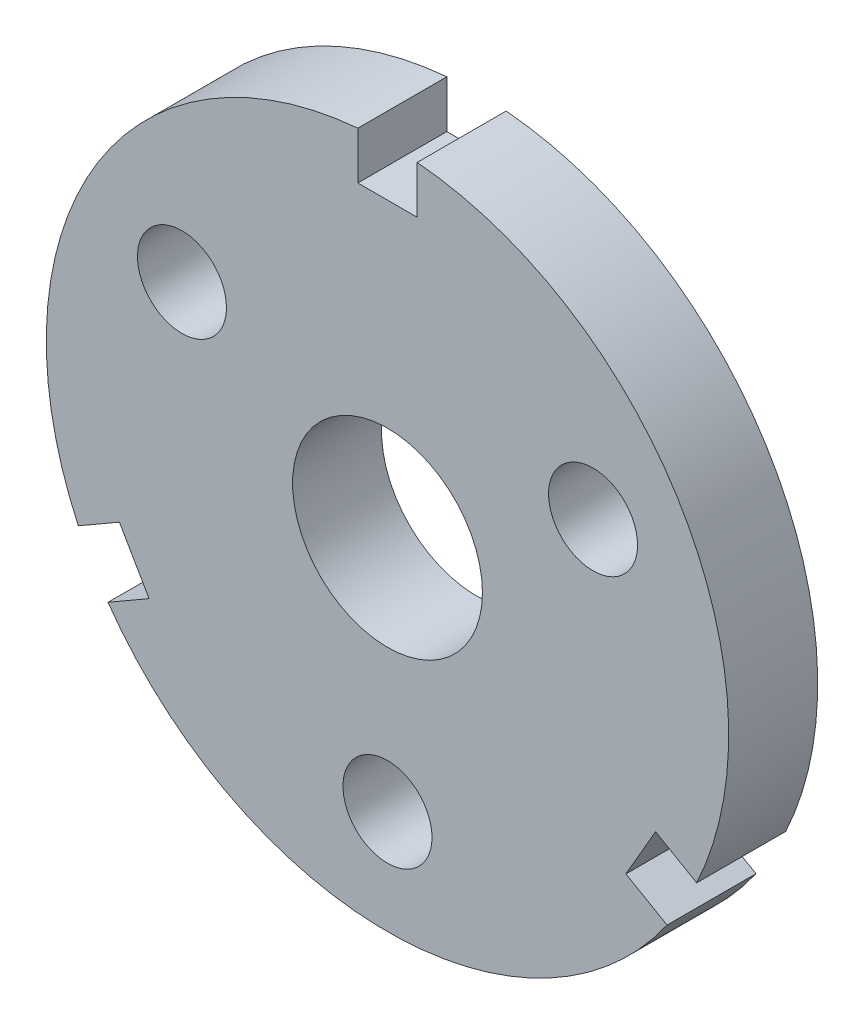
ISO-10303-21;
HEADER;
FILE_DESCRIPTION(('STEP AP214'),'2;1');
FILE_NAME('part.step','',(''),(''),'','','');
FILE_SCHEMA(('AUTOMOTIVE_DESIGN { 1 0 10303 214 1 1 1 1 }'));
ENDSEC;
DATA;
#1=APPLICATION_CONTEXT('core data for automotive mechanical design processes');
#2=APPLICATION_PROTOCOL_DEFINITION('international standard','automotive_design',2000,#1);
#3=PRODUCT_CONTEXT('',#1,'mechanical');
#4=PRODUCT('Part','Part','',(#3));
#5=PRODUCT_RELATED_PRODUCT_CATEGORY('part','',(#4));
#6=PRODUCT_DEFINITION_FORMATION('','',#4);
#7=PRODUCT_DEFINITION_CONTEXT('part definition',#1,'design');
#8=PRODUCT_DEFINITION('design','',#6,#7);
#9=PRODUCT_DEFINITION_SHAPE('','',#8);
#10=(LENGTH_UNIT() NAMED_UNIT(*) SI_UNIT(.MILLI.,.METRE.));
#11=(NAMED_UNIT(*) PLANE_ANGLE_UNIT() SI_UNIT($,.RADIAN.));
#12=(NAMED_UNIT(*) SI_UNIT($,.STERADIAN.) SOLID_ANGLE_UNIT());
#13=UNCERTAINTY_MEASURE_WITH_UNIT(LENGTH_MEASURE(1.E-05),#10,'distance_accuracy_value','');
#14=(GEOMETRIC_REPRESENTATION_CONTEXT(3) GLOBAL_UNCERTAINTY_ASSIGNED_CONTEXT((#13)) GLOBAL_UNIT_ASSIGNED_CONTEXT((#10,
#11,#12)) REPRESENTATION_CONTEXT('',''));
#15=CARTESIAN_POINT('',(0.,0.,0.));
#16=DIRECTION('',(0.,0.,1.));
#17=DIRECTION('',(1.,0.,0.));
#18=AXIS2_PLACEMENT_3D('',#15,#16,#17);
#19=CARTESIAN_POINT('',(-5.,0.,15.));
#20=DIRECTION('',(1.,0.,0.));
#21=DIRECTION('',(0.,0.,-1.));
#22=AXIS2_PLACEMENT_3D('',#19,#20,#21);
#23=PLANE('',#22);
#24=DIRECTION('',(0.,-1.,0.));
#25=VECTOR('',#24,1.);
#26=CARTESIAN_POINT('',(-5.,0.,0.));
#27=LINE('',#26,#25);
#28=CARTESIAN_POINT('',(-5.,57.282196186948,0.));
#29=VERTEX_POINT('',#28);
#30=CARTESIAN_POINT('',(-5.,49.282196186948,0.));
#31=VERTEX_POINT('',#30);
#32=EDGE_CURVE('E176',#29,#31,#27,.T.);
#33=ORIENTED_EDGE('',*,*,#32,.F.);
#34=DIRECTION('',(0.,0.,-1.));
#35=VECTOR('',#34,1.);
#36=CARTESIAN_POINT('',(-5.,57.282196186948,15.));
#37=LINE('',#36,#35);
#38=CARTESIAN_POINT('',(-5.,57.282196186948,15.));
#39=VERTEX_POINT('',#38);
#40=EDGE_CURVE('E11',#39,#29,#37,.T.);
#41=ORIENTED_EDGE('',*,*,#40,.F.);
#42=DIRECTION('',(0.,-1.,0.));
#43=VECTOR('',#42,1.);
#44=CARTESIAN_POINT('',(-5.,0.,15.));
#45=LINE('',#44,#43);
#46=CARTESIAN_POINT('',(-5.,49.282196186948,15.));
#47=VERTEX_POINT('',#46);
#48=EDGE_CURVE('E214',#39,#47,#45,.T.);
#49=ORIENTED_EDGE('',*,*,#48,.T.);
#50=DIRECTION('',(0.,0.,-1.));
#51=VECTOR('',#50,1.);
#52=CARTESIAN_POINT('',(-5.,49.282196186948,15.));
#53=LINE('',#52,#51);
#54=EDGE_CURVE('E107',#47,#31,#53,.T.);
#55=ORIENTED_EDGE('',*,*,#54,.T.);
#56=EDGE_LOOP('',(#33,#41,#49,#55));
#57=FACE_BOUND('',#56,.T.);
#58=ADVANCED_FACE('F43',(#57),#23,.T.);
#59=CARTESIAN_POINT('',(0.,0.,15.));
#60=DIRECTION('',(0.,0.,-1.));
#61=DIRECTION('',(-1.,0.,0.));
#62=AXIS2_PLACEMENT_3D('',#59,#60,#61);
#63=CYLINDRICAL_SURFACE('',#62,57.5);
#64=CARTESIAN_POINT('',(0.,0.,0.));
#65=DIRECTION('',(0.,0.,1.));
#66=DIRECTION('',(1.,0.,0.));
#67=AXIS2_PLACEMENT_3D('',#64,#65,#66);
#68=CIRCLE('',#67,57.5);
#69=CARTESIAN_POINT('',(-52.1078370824611,-24.3109710745517,0.));
#70=VERTEX_POINT('',#69);
#71=EDGE_CURVE('E177',#29,#70,#68,.T.);
#72=ORIENTED_EDGE('',*,*,#71,.T.);
#73=DIRECTION('',(0.,0.,-1.));
#74=VECTOR('',#73,1.);
#75=CARTESIAN_POINT('',(-52.1078370824611,-24.3109710745517,15.));
#76=LINE('',#75,#74);
#77=CARTESIAN_POINT('',(-52.1078370824611,-24.3109710745517,15.));
#78=VERTEX_POINT('',#77);
#79=EDGE_CURVE('E51',#78,#70,#76,.T.);
#80=ORIENTED_EDGE('',*,*,#79,.F.);
#81=CARTESIAN_POINT('',(0.,0.,15.));
#82=DIRECTION('',(0.,0.,1.));
#83=DIRECTION('',(1.,0.,0.));
#84=AXIS2_PLACEMENT_3D('',#81,#82,#83);
#85=CIRCLE('',#84,57.5);
#86=EDGE_CURVE('E148',#39,#78,#85,.T.);
#87=ORIENTED_EDGE('',*,*,#86,.F.);
#88=ORIENTED_EDGE('',*,*,#40,.T.);
#89=EDGE_LOOP('',(#72,#80,#87,#88));
#90=FACE_BOUND('',#89,.T.);
#91=ADVANCED_FACE('F279',(#90),#63,.T.);
#92=CARTESIAN_POINT('',(-2.49999999999999,4.33012701892219,15.));
#93=DIRECTION('',(-0.499999999999998,0.86602540378444,0.));
#94=DIRECTION('',(-0.86602540378444,-0.499999999999998,0.));
#95=AXIS2_PLACEMENT_3D('',#92,#93,#94);
#96=PLANE('',#95);
#97=DIRECTION('',(0.86602540378444,0.499999999999998,0.));
#98=VECTOR('',#97,1.);
#99=CARTESIAN_POINT('',(-2.49999999999999,4.33012701892219,0.));
#100=LINE('',#99,#98);
#101=CARTESIAN_POINT('',(-45.1796338521856,-20.3109710745517,0.));
#102=VERTEX_POINT('',#101);
#103=EDGE_CURVE('E181',#70,#102,#100,.T.);
#104=ORIENTED_EDGE('',*,*,#103,.T.);
#105=DIRECTION('',(0.,0.,-1.));
#106=VECTOR('',#105,1.);
#107=CARTESIAN_POINT('',(-45.1796338521856,-20.3109710745517,15.));
#108=LINE('',#107,#106);
#109=CARTESIAN_POINT('',(-45.1796338521856,-20.3109710745517,15.));
#110=VERTEX_POINT('',#109);
#111=EDGE_CURVE('E229',#110,#102,#108,.T.);
#112=ORIENTED_EDGE('',*,*,#111,.F.);
#113=DIRECTION('',(0.86602540378444,0.499999999999998,0.));
#114=VECTOR('',#113,1.);
#115=CARTESIAN_POINT('',(-2.49999999999999,4.33012701892219,15.));
#116=LINE('',#115,#114);
#117=EDGE_CURVE('E239',#78,#110,#116,.T.);
#118=ORIENTED_EDGE('',*,*,#117,.F.);
#119=ORIENTED_EDGE('',*,*,#79,.T.);
#120=EDGE_LOOP('',(#104,#112,#118,#119));
#121=FACE_BOUND('',#120,.T.);
#122=ADVANCED_FACE('F237',(#121),#96,.F.);
#123=CARTESIAN_POINT('',(-42.6796338521857,-24.6410980934739,15.));
#124=DIRECTION('',(-0.86602540378444,-0.499999999999997,0.));
#125=DIRECTION('',(0.499999999999997,-0.86602540378444,0.));
#126=AXIS2_PLACEMENT_3D('',#123,#124,#125);
#127=PLANE('',#126);
#128=DIRECTION('',(-0.499999999999997,0.86602540378444,0.));
#129=VECTOR('',#128,1.);
#130=CARTESIAN_POINT('',(-42.6796338521857,-24.6410980934739,0.));
#131=LINE('',#130,#129);
#132=CARTESIAN_POINT('',(-40.1796338521856,-28.9712251123961,0.));
#133=VERTEX_POINT('',#132);
#134=EDGE_CURVE('E184',#133,#102,#131,.T.);
#135=ORIENTED_EDGE('',*,*,#134,.F.);
#136=DIRECTION('',(0.,0.,-1.));
#137=VECTOR('',#136,1.);
#138=CARTESIAN_POINT('',(-40.1796338521856,-28.9712251123961,15.));
#139=LINE('',#138,#137);
#140=CARTESIAN_POINT('',(-40.1796338521856,-28.9712251123961,15.));
#141=VERTEX_POINT('',#140);
#142=EDGE_CURVE('E228',#141,#133,#139,.T.);
#143=ORIENTED_EDGE('',*,*,#142,.F.);
#144=DIRECTION('',(-0.499999999999997,0.86602540378444,0.));
#145=VECTOR('',#144,1.);
#146=CARTESIAN_POINT('',(-42.6796338521857,-24.6410980934739,15.));
#147=LINE('',#146,#145);
#148=EDGE_CURVE('E252',#141,#110,#147,.T.);
#149=ORIENTED_EDGE('',*,*,#148,.T.);
#150=ORIENTED_EDGE('',*,*,#111,.T.);
#151=EDGE_LOOP('',(#135,#143,#149,#150));
#152=FACE_BOUND('',#151,.T.);
#153=ADVANCED_FACE('F246',(#152),#127,.T.);
#154=CARTESIAN_POINT('',(2.49999999999999,-4.3301270189222,15.));
#155=DIRECTION('',(-0.499999999999998,0.86602540378444,0.));
#156=DIRECTION('',(-0.86602540378444,-0.499999999999998,0.));
#157=AXIS2_PLACEMENT_3D('',#154,#155,#156);
#158=PLANE('',#157);
#159=DIRECTION('',(0.86602540378444,0.499999999999998,0.));
#160=VECTOR('',#159,1.);
#161=CARTESIAN_POINT('',(2.49999999999999,-4.3301270189222,0.));
#162=LINE('',#161,#160);
#163=CARTESIAN_POINT('',(-47.1078370824611,-32.9712251123961,0.));
#164=VERTEX_POINT('',#163);
#165=EDGE_CURVE('E187',#164,#133,#162,.T.);
#166=ORIENTED_EDGE('',*,*,#165,.F.);
#167=DIRECTION('',(0.,0.,-1.));
#168=VECTOR('',#167,1.);
#169=CARTESIAN_POINT('',(-47.1078370824611,-32.9712251123961,15.));
#170=LINE('',#169,#168);
#171=CARTESIAN_POINT('',(-47.1078370824611,-32.9712251123961,15.));
#172=VERTEX_POINT('',#171);
#173=EDGE_CURVE('E226',#172,#164,#170,.T.);
#174=ORIENTED_EDGE('',*,*,#173,.F.);
#175=DIRECTION('',(0.86602540378444,0.499999999999998,0.));
#176=VECTOR('',#175,1.);
#177=CARTESIAN_POINT('',(2.49999999999999,-4.3301270189222,15.));
#178=LINE('',#177,#176);
#179=EDGE_CURVE('E251',#172,#141,#178,.T.);
#180=ORIENTED_EDGE('',*,*,#179,.T.);
#181=ORIENTED_EDGE('',*,*,#142,.T.);
#182=EDGE_LOOP('',(#166,#174,#180,#181));
#183=FACE_BOUND('',#182,.T.);
#184=ADVANCED_FACE('F292',(#183),#158,.T.);
#185=CARTESIAN_POINT('',(47.1078370824614,-32.9712251123957,0.));
#186=VERTEX_POINT('',#185);
#187=EDGE_CURVE('E185',#164,#186,#68,.T.);
#188=ORIENTED_EDGE('',*,*,#187,.T.);
#189=DIRECTION('',(0.,0.,-1.));
#190=VECTOR('',#189,1.);
#191=CARTESIAN_POINT('',(47.1078370824614,-32.9712251123957,15.));
#192=LINE('',#191,#190);
#193=CARTESIAN_POINT('',(47.1078370824614,-32.9712251123957,15.));
#194=VERTEX_POINT('',#193);
#195=EDGE_CURVE('E223',#194,#186,#192,.T.);
#196=ORIENTED_EDGE('',*,*,#195,.F.);
#197=EDGE_CURVE('E146',#172,#194,#85,.T.);
#198=ORIENTED_EDGE('',*,*,#197,.F.);
#199=ORIENTED_EDGE('',*,*,#173,.T.);
#200=EDGE_LOOP('',(#188,#196,#198,#199));
#201=FACE_BOUND('',#200,.T.);
#202=ADVANCED_FACE('F269',(#201),#63,.T.);
#203=CARTESIAN_POINT('',(-2.49999999999992,-4.33012701892214,15.));
#204=DIRECTION('',(-0.499999999999993,-0.866025403784443,0.));
#205=DIRECTION('',(0.866025403784443,-0.499999999999993,0.));
#206=AXIS2_PLACEMENT_3D('',#203,#204,#205);
#207=PLANE('',#206);
#208=DIRECTION('',(-0.866025403784443,0.499999999999993,0.));
#209=VECTOR('',#208,1.);
#210=CARTESIAN_POINT('',(-2.49999999999992,-4.33012701892214,0.));
#211=LINE('',#210,#209);
#212=CARTESIAN_POINT('',(40.1796338521859,-28.9712251123958,0.));
#213=VERTEX_POINT('',#212);
#214=EDGE_CURVE('E192',#186,#213,#211,.T.);
#215=ORIENTED_EDGE('',*,*,#214,.T.);
#216=DIRECTION('',(0.,0.,-1.));
#217=VECTOR('',#216,1.);
#218=CARTESIAN_POINT('',(40.1796338521859,-28.9712251123958,15.));
#219=LINE('',#218,#217);
#220=CARTESIAN_POINT('',(40.1796338521859,-28.9712251123958,15.));
#221=VERTEX_POINT('',#220);
#222=EDGE_CURVE('E221',#221,#213,#219,.T.);
#223=ORIENTED_EDGE('',*,*,#222,.F.);
#224=DIRECTION('',(-0.866025403784443,0.499999999999993,0.));
#225=VECTOR('',#224,1.);
#226=CARTESIAN_POINT('',(-2.49999999999992,-4.33012701892214,15.));
#227=LINE('',#226,#225);
#228=EDGE_CURVE('E260',#194,#221,#227,.T.);
#229=ORIENTED_EDGE('',*,*,#228,.F.);
#230=ORIENTED_EDGE('',*,*,#195,.T.);
#231=EDGE_LOOP('',(#215,#223,#229,#230));
#232=FACE_BOUND('',#231,.T.);
#233=ADVANCED_FACE('F274',(#232),#207,.F.);
#234=CARTESIAN_POINT('',(42.6796338521858,-24.6410980934735,15.));
#235=DIRECTION('',(0.866025403784444,-0.499999999999991,0.));
#236=DIRECTION('',(0.499999999999991,0.866025403784444,0.));
#237=AXIS2_PLACEMENT_3D('',#234,#235,#236);
#238=PLANE('',#237);
#239=DIRECTION('',(-0.499999999999991,-0.866025403784444,0.));
#240=VECTOR('',#239,1.);
#241=CARTESIAN_POINT('',(42.6796338521858,-24.6410980934735,0.));
#242=LINE('',#241,#240);
#243=CARTESIAN_POINT('',(45.1796338521858,-20.3109710745514,0.));
#244=VERTEX_POINT('',#243);
#245=EDGE_CURVE('E191',#244,#213,#242,.T.);
#246=ORIENTED_EDGE('',*,*,#245,.F.);
#247=DIRECTION('',(0.,0.,-1.));
#248=VECTOR('',#247,1.);
#249=CARTESIAN_POINT('',(45.1796338521858,-20.3109710745514,15.));
#250=LINE('',#249,#248);
#251=CARTESIAN_POINT('',(45.1796338521858,-20.3109710745514,15.));
#252=VERTEX_POINT('',#251);
#253=EDGE_CURVE('E219',#252,#244,#250,.T.);
#254=ORIENTED_EDGE('',*,*,#253,.F.);
#255=DIRECTION('',(-0.499999999999991,-0.866025403784444,0.));
#256=VECTOR('',#255,1.);
#257=CARTESIAN_POINT('',(42.6796338521858,-24.6410980934735,15.));
#258=LINE('',#257,#256);
#259=EDGE_CURVE('E259',#252,#221,#258,.T.);
#260=ORIENTED_EDGE('',*,*,#259,.T.);
#261=ORIENTED_EDGE('',*,*,#222,.T.);
#262=EDGE_LOOP('',(#246,#254,#260,#261));
#263=FACE_BOUND('',#262,.T.);
#264=ADVANCED_FACE('F280',(#263),#238,.T.);
#265=CARTESIAN_POINT('',(2.49999999999994,4.3301270189222,15.));
#266=DIRECTION('',(-0.499999999999991,-0.866025403784444,0.));
#267=DIRECTION('',(0.866025403784444,-0.499999999999991,0.));
#268=AXIS2_PLACEMENT_3D('',#265,#266,#267);
#269=PLANE('',#268);
#270=DIRECTION('',(-0.866025403784444,0.499999999999991,0.));
#271=VECTOR('',#270,1.);
#272=CARTESIAN_POINT('',(2.49999999999994,4.3301270189222,0.));
#273=LINE('',#272,#271);
#274=CARTESIAN_POINT('',(52.1078370824613,-24.3109710745513,0.));
#275=VERTEX_POINT('',#274);
#276=EDGE_CURVE('E199',#275,#244,#273,.T.);
#277=ORIENTED_EDGE('',*,*,#276,.F.);
#278=DIRECTION('',(0.,0.,-1.));
#279=VECTOR('',#278,1.);
#280=CARTESIAN_POINT('',(52.1078370824613,-24.3109710745513,15.));
#281=LINE('',#280,#279);
#282=CARTESIAN_POINT('',(52.1078370824613,-24.3109710745513,15.));
#283=VERTEX_POINT('',#282);
#284=EDGE_CURVE('E153',#283,#275,#281,.T.);
#285=ORIENTED_EDGE('',*,*,#284,.F.);
#286=DIRECTION('',(-0.866025403784444,0.499999999999991,0.));
#287=VECTOR('',#286,1.);
#288=CARTESIAN_POINT('',(2.49999999999994,4.3301270189222,15.));
#289=LINE('',#288,#287);
#290=EDGE_CURVE('E147',#283,#252,#289,.T.);
#291=ORIENTED_EDGE('',*,*,#290,.T.);
#292=ORIENTED_EDGE('',*,*,#253,.T.);
#293=EDGE_LOOP('',(#277,#285,#291,#292));
#294=FACE_BOUND('',#293,.T.);
#295=ADVANCED_FACE('F262',(#294),#269,.T.);
#296=CARTESIAN_POINT('',(5.,57.282196186948,0.));
#297=VERTEX_POINT('',#296);
#298=EDGE_CURVE('E151',#275,#297,#68,.T.);
#299=ORIENTED_EDGE('',*,*,#298,.T.);
#300=DIRECTION('',(0.,0.,-1.));
#301=VECTOR('',#300,1.);
#302=CARTESIAN_POINT('',(5.,57.282196186948,15.));
#303=LINE('',#302,#301);
#304=CARTESIAN_POINT('',(5.,57.282196186948,15.));
#305=VERTEX_POINT('',#304);
#306=EDGE_CURVE('E152',#305,#297,#303,.T.);
#307=ORIENTED_EDGE('',*,*,#306,.F.);
#308=EDGE_CURVE('E138',#283,#305,#85,.T.);
#309=ORIENTED_EDGE('',*,*,#308,.F.);
#310=ORIENTED_EDGE('',*,*,#284,.T.);
#311=EDGE_LOOP('',(#299,#307,#309,#310));
#312=FACE_BOUND('',#311,.T.);
#313=ADVANCED_FACE('F154',(#312),#63,.T.);
#314=CARTESIAN_POINT('',(5.,0.,15.));
#315=DIRECTION('',(1.,0.,0.));
#316=DIRECTION('',(0.,0.,-1.));
#317=AXIS2_PLACEMENT_3D('',#314,#315,#316);
#318=PLANE('',#317);
#319=DIRECTION('',(0.,-1.,0.));
#320=VECTOR('',#319,1.);
#321=CARTESIAN_POINT('',(5.,0.,0.));
#322=LINE('',#321,#320);
#323=CARTESIAN_POINT('',(5.,49.282196186948,0.));
#324=VERTEX_POINT('',#323);
#325=EDGE_CURVE('E98',#297,#324,#322,.T.);
#326=ORIENTED_EDGE('',*,*,#325,.T.);
#327=DIRECTION('',(0.,0.,-1.));
#328=VECTOR('',#327,1.);
#329=CARTESIAN_POINT('',(5.,49.282196186948,15.));
#330=LINE('',#329,#328);
#331=CARTESIAN_POINT('',(5.,49.282196186948,15.));
#332=VERTEX_POINT('',#331);
#333=EDGE_CURVE('E157',#332,#324,#330,.T.);
#334=ORIENTED_EDGE('',*,*,#333,.F.);
#335=DIRECTION('',(0.,-1.,0.));
#336=VECTOR('',#335,1.);
#337=CARTESIAN_POINT('',(5.,0.,15.));
#338=LINE('',#337,#336);
#339=EDGE_CURVE('E142',#305,#332,#338,.T.);
#340=ORIENTED_EDGE('',*,*,#339,.F.);
#341=ORIENTED_EDGE('',*,*,#306,.T.);
#342=EDGE_LOOP('',(#326,#334,#340,#341));
#343=FACE_BOUND('',#342,.T.);
#344=ADVANCED_FACE('F156',(#343),#318,.F.);
#345=CARTESIAN_POINT('',(0.,-40.,15.));
#346=DIRECTION('',(0.,0.,-1.));
#347=DIRECTION('',(-1.,0.,0.));
#348=AXIS2_PLACEMENT_3D('',#345,#346,#347);
#349=CYLINDRICAL_SURFACE('',#348,7.5);
#350=CARTESIAN_POINT('',(0.,-40.,15.));
#351=DIRECTION('',(0.,0.,1.));
#352=DIRECTION('',(1.,0.,0.));
#353=AXIS2_PLACEMENT_3D('',#350,#351,#352);
#354=CIRCLE('',#353,7.5);
#355=CARTESIAN_POINT('',(7.5,-40.,15.));
#356=VERTEX_POINT('',#355);
#357=EDGE_CURVE('E169',#356,#356,#354,.T.);
#358=ORIENTED_EDGE('',*,*,#357,.T.);
#359=EDGE_LOOP('',(#358));
#360=FACE_BOUND('',#359,.T.);
#361=CARTESIAN_POINT('',(0.,-40.,0.));
#362=DIRECTION('',(0.,0.,1.));
#363=DIRECTION('',(1.,0.,0.));
#364=AXIS2_PLACEMENT_3D('',#361,#362,#363);
#365=CIRCLE('',#364,7.5);
#366=CARTESIAN_POINT('',(7.5,-40.,0.));
#367=VERTEX_POINT('',#366);
#368=EDGE_CURVE('E206',#367,#367,#365,.T.);
#369=ORIENTED_EDGE('',*,*,#368,.F.);
#370=EDGE_LOOP('',(#369));
#371=FACE_BOUND('',#370,.T.);
#372=ADVANCED_FACE('F299',(#360,#371),#349,.F.);
#373=CARTESIAN_POINT('',(-34.6410161513775,20.,15.));
#374=DIRECTION('',(0.,0.,-1.));
#375=DIRECTION('',(-1.,0.,0.));
#376=AXIS2_PLACEMENT_3D('',#373,#374,#375);
#377=CYLINDRICAL_SURFACE('',#376,7.49999999999999);
#378=CARTESIAN_POINT('',(-34.6410161513775,20.,15.));
#379=DIRECTION('',(0.,0.,1.));
#380=DIRECTION('',(1.,0.,0.));
#381=AXIS2_PLACEMENT_3D('',#378,#379,#380);
#382=CIRCLE('',#381,7.49999999999999);
#383=CARTESIAN_POINT('',(-27.1410161513775,20.,15.));
#384=VERTEX_POINT('',#383);
#385=EDGE_CURVE('E167',#384,#384,#382,.T.);
#386=ORIENTED_EDGE('',*,*,#385,.T.);
#387=EDGE_LOOP('',(#386));
#388=FACE_BOUND('',#387,.T.);
#389=CARTESIAN_POINT('',(-34.6410161513775,20.,0.));
#390=DIRECTION('',(0.,0.,1.));
#391=DIRECTION('',(1.,0.,0.));
#392=AXIS2_PLACEMENT_3D('',#389,#390,#391);
#393=CIRCLE('',#392,7.49999999999999);
#394=CARTESIAN_POINT('',(-27.1410161513775,20.,0.));
#395=VERTEX_POINT('',#394);
#396=EDGE_CURVE('E207',#395,#395,#393,.T.);
#397=ORIENTED_EDGE('',*,*,#396,.F.);
#398=EDGE_LOOP('',(#397));
#399=FACE_BOUND('',#398,.T.);
#400=ADVANCED_FACE('F360',(#388,#399),#377,.F.);
#401=CARTESIAN_POINT('',(0.,0.,15.));
#402=DIRECTION('',(0.,0.,-1.));
#403=DIRECTION('',(-1.,0.,0.));
#404=AXIS2_PLACEMENT_3D('',#401,#402,#403);
#405=CYLINDRICAL_SURFACE('',#404,16.);
#406=CARTESIAN_POINT('',(0.,0.,15.));
#407=DIRECTION('',(0.,0.,1.));
#408=DIRECTION('',(1.,0.,0.));
#409=AXIS2_PLACEMENT_3D('',#406,#407,#408);
#410=CIRCLE('',#409,16.);
#411=CARTESIAN_POINT('',(16.,0.,15.));
#412=VERTEX_POINT('',#411);
#413=EDGE_CURVE('E158',#412,#412,#410,.T.);
#414=ORIENTED_EDGE('',*,*,#413,.T.);
#415=EDGE_LOOP('',(#414));
#416=FACE_BOUND('',#415,.T.);
#417=CARTESIAN_POINT('',(0.,0.,0.));
#418=DIRECTION('',(0.,0.,1.));
#419=DIRECTION('',(1.,0.,0.));
#420=AXIS2_PLACEMENT_3D('',#417,#418,#419);
#421=CIRCLE('',#420,16.);
#422=CARTESIAN_POINT('',(16.,0.,0.));
#423=VERTEX_POINT('',#422);
#424=EDGE_CURVE('E201',#423,#423,#421,.T.);
#425=ORIENTED_EDGE('',*,*,#424,.F.);
#426=EDGE_LOOP('',(#425));
#427=FACE_BOUND('',#426,.T.);
#428=ADVANCED_FACE('F370',(#416,#427),#405,.F.);
#429=CARTESIAN_POINT('',(0.,49.282196186948,15.));
#430=DIRECTION('',(0.,-1.,0.));
#431=DIRECTION('',(0.,0.,-1.));
#432=AXIS2_PLACEMENT_3D('',#429,#430,#431);
#433=PLANE('',#432);
#434=DIRECTION('',(-1.,0.,0.));
#435=VECTOR('',#434,1.);
#436=CARTESIAN_POINT('',(0.,49.282196186948,0.));
#437=LINE('',#436,#435);
#438=EDGE_CURVE('E202',#324,#31,#437,.T.);
#439=ORIENTED_EDGE('',*,*,#438,.T.);
#440=ORIENTED_EDGE('',*,*,#54,.F.);
#441=DIRECTION('',(-1.,0.,0.));
#442=VECTOR('',#441,1.);
#443=CARTESIAN_POINT('',(0.,49.282196186948,15.));
#444=LINE('',#443,#442);
#445=EDGE_CURVE('E56',#332,#47,#444,.T.);
#446=ORIENTED_EDGE('',*,*,#445,.F.);
#447=ORIENTED_EDGE('',*,*,#333,.T.);
#448=EDGE_LOOP('',(#439,#440,#446,#447));
#449=FACE_BOUND('',#448,.T.);
#450=ADVANCED_FACE('F379',(#449),#433,.F.);
#451=CARTESIAN_POINT('',(34.6410161513775,20.,15.));
#452=DIRECTION('',(0.,0.,-1.));
#453=DIRECTION('',(-1.,0.,0.));
#454=AXIS2_PLACEMENT_3D('',#451,#452,#453);
#455=CYLINDRICAL_SURFACE('',#454,7.49999999999999);
#456=CARTESIAN_POINT('',(34.6410161513775,20.,15.));
#457=DIRECTION('',(0.,0.,1.));
#458=DIRECTION('',(1.,0.,0.));
#459=AXIS2_PLACEMENT_3D('',#456,#457,#458);
#460=CIRCLE('',#459,7.49999999999999);
#461=CARTESIAN_POINT('',(42.1410161513775,20.,15.));
#462=VERTEX_POINT('',#461);
#463=EDGE_CURVE('E171',#462,#462,#460,.F.);
#464=ORIENTED_EDGE('',*,*,#463,.F.);
#465=EDGE_LOOP('',(#464));
#466=FACE_BOUND('',#465,.T.);
#467=CARTESIAN_POINT('',(34.6410161513775,20.,0.));
#468=DIRECTION('',(0.,0.,1.));
#469=DIRECTION('',(1.,0.,0.));
#470=AXIS2_PLACEMENT_3D('',#467,#468,#469);
#471=CIRCLE('',#470,7.49999999999999);
#472=CARTESIAN_POINT('',(42.1410161513775,20.,0.));
#473=VERTEX_POINT('',#472);
#474=EDGE_CURVE('E212',#473,#473,#471,.F.);
#475=ORIENTED_EDGE('',*,*,#474,.T.);
#476=EDGE_LOOP('',(#475));
#477=FACE_BOUND('',#476,.T.);
#478=ADVANCED_FACE('F389',(#466,#477),#455,.F.);
#479=CARTESIAN_POINT('',(0.,0.,15.));
#480=DIRECTION('',(0.,0.,1.));
#481=DIRECTION('',(1.,0.,0.));
#482=AXIS2_PLACEMENT_3D('',#479,#480,#481);
#483=PLANE('',#482);
#484=ORIENTED_EDGE('',*,*,#48,.F.);
#485=ORIENTED_EDGE('',*,*,#86,.T.);
#486=ORIENTED_EDGE('',*,*,#117,.T.);
#487=ORIENTED_EDGE('',*,*,#148,.F.);
#488=ORIENTED_EDGE('',*,*,#179,.F.);
#489=ORIENTED_EDGE('',*,*,#197,.T.);
#490=ORIENTED_EDGE('',*,*,#228,.T.);
#491=ORIENTED_EDGE('',*,*,#259,.F.);
#492=ORIENTED_EDGE('',*,*,#290,.F.);
#493=ORIENTED_EDGE('',*,*,#308,.T.);
#494=ORIENTED_EDGE('',*,*,#339,.T.);
#495=ORIENTED_EDGE('',*,*,#445,.T.);
#496=EDGE_LOOP('',(#484,#485,#486,#487,#488,#489,#490,#491,#492,#493,#494,#495));
#497=FACE_BOUND('',#496,.T.);
#498=ORIENTED_EDGE('',*,*,#413,.F.);
#499=EDGE_LOOP('',(#498));
#500=FACE_BOUND('',#499,.T.);
#501=ORIENTED_EDGE('',*,*,#385,.F.);
#502=EDGE_LOOP('',(#501));
#503=FACE_BOUND('',#502,.T.);
#504=ORIENTED_EDGE('',*,*,#357,.F.);
#505=EDGE_LOOP('',(#504));
#506=FACE_BOUND('',#505,.T.);
#507=ORIENTED_EDGE('',*,*,#463,.T.);
#508=EDGE_LOOP('',(#507));
#509=FACE_BOUND('',#508,.T.);
#510=ADVANCED_FACE('F139',(#497,#500,#503,#506,#509),#483,.T.);
#511=CARTESIAN_POINT('',(0.,0.,0.));
#512=DIRECTION('',(0.,0.,1.));
#513=DIRECTION('',(1.,0.,0.));
#514=AXIS2_PLACEMENT_3D('',#511,#512,#513);
#515=PLANE('',#514);
#516=ORIENTED_EDGE('',*,*,#32,.T.);
#517=ORIENTED_EDGE('',*,*,#438,.F.);
#518=ORIENTED_EDGE('',*,*,#325,.F.);
#519=ORIENTED_EDGE('',*,*,#298,.F.);
#520=ORIENTED_EDGE('',*,*,#276,.T.);
#521=ORIENTED_EDGE('',*,*,#245,.T.);
#522=ORIENTED_EDGE('',*,*,#214,.F.);
#523=ORIENTED_EDGE('',*,*,#187,.F.);
#524=ORIENTED_EDGE('',*,*,#165,.T.);
#525=ORIENTED_EDGE('',*,*,#134,.T.);
#526=ORIENTED_EDGE('',*,*,#103,.F.);
#527=ORIENTED_EDGE('',*,*,#71,.F.);
#528=EDGE_LOOP('',(#516,#517,#518,#519,#520,#521,#522,#523,#524,#525,#526,#527));
#529=FACE_BOUND('',#528,.T.);
#530=ORIENTED_EDGE('',*,*,#424,.T.);
#531=EDGE_LOOP('',(#530));
#532=FACE_BOUND('',#531,.T.);
#533=ORIENTED_EDGE('',*,*,#396,.T.);
#534=EDGE_LOOP('',(#533));
#535=FACE_BOUND('',#534,.T.);
#536=ORIENTED_EDGE('',*,*,#368,.T.);
#537=EDGE_LOOP('',(#536));
#538=FACE_BOUND('',#537,.T.);
#539=ORIENTED_EDGE('',*,*,#474,.F.);
#540=EDGE_LOOP('',(#539));
#541=FACE_BOUND('',#540,.T.);
#542=ADVANCED_FACE('F244',(#529,#532,#535,#538,#541),#515,.F.);
#543=CLOSED_SHELL('',(#58,#91,#122,#153,#184,#202,#233,#264,#295,#313,#344,#372,#400,#428,#450,
#478,#510,#542));
#544=MANIFOLD_SOLID_BREP('B2',#543);
#545=ADVANCED_BREP_SHAPE_REPRESENTATION('',(#18,#544),#14);
#546=SHAPE_DEFINITION_REPRESENTATION(#9,#545);
ENDSEC;
END-ISO-10303-21;
